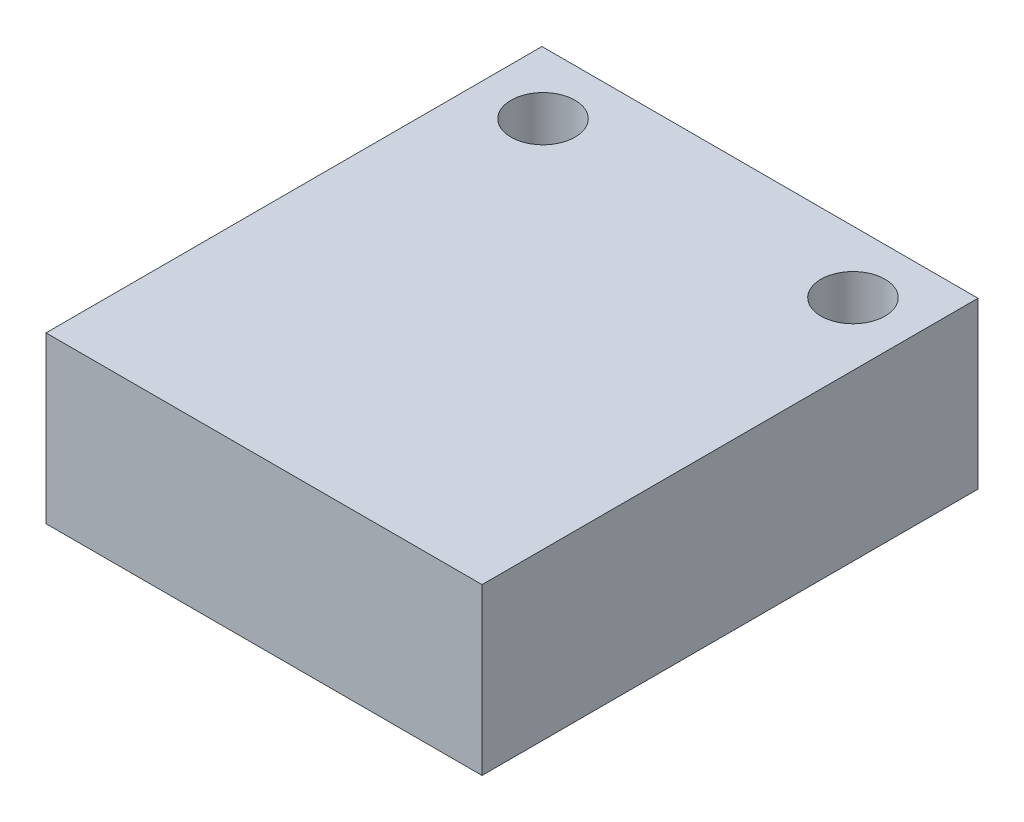
ISO-10303-21;
HEADER;
FILE_DESCRIPTION(('STEP AP214'),'2;1');
FILE_NAME('part.step','',(''),(''),'','','');
FILE_SCHEMA(('AUTOMOTIVE_DESIGN { 1 0 10303 214 1 1 1 1 }'));
ENDSEC;
DATA;
#1=APPLICATION_CONTEXT('core data for automotive mechanical design processes');
#2=APPLICATION_PROTOCOL_DEFINITION('international standard','automotive_design',2000,#1);
#3=PRODUCT_CONTEXT('',#1,'mechanical');
#4=PRODUCT('Part','Part','',(#3));
#5=PRODUCT_RELATED_PRODUCT_CATEGORY('part','',(#4));
#6=PRODUCT_DEFINITION_FORMATION('','',#4);
#7=PRODUCT_DEFINITION_CONTEXT('part definition',#1,'design');
#8=PRODUCT_DEFINITION('design','',#6,#7);
#9=PRODUCT_DEFINITION_SHAPE('','',#8);
#10=(LENGTH_UNIT() NAMED_UNIT(*) SI_UNIT(.MILLI.,.METRE.));
#11=(NAMED_UNIT(*) PLANE_ANGLE_UNIT() SI_UNIT($,.RADIAN.));
#12=(NAMED_UNIT(*) SI_UNIT($,.STERADIAN.) SOLID_ANGLE_UNIT());
#13=UNCERTAINTY_MEASURE_WITH_UNIT(LENGTH_MEASURE(1.E-05),#10,'distance_accuracy_value','');
#14=(GEOMETRIC_REPRESENTATION_CONTEXT(3) GLOBAL_UNCERTAINTY_ASSIGNED_CONTEXT((#13)) GLOBAL_UNIT_ASSIGNED_CONTEXT((#10,
#11,#12)) REPRESENTATION_CONTEXT('',''));
#15=CARTESIAN_POINT('',(0.,0.,0.));
#16=DIRECTION('',(0.,0.,1.));
#17=DIRECTION('',(1.,0.,0.));
#18=AXIS2_PLACEMENT_3D('',#15,#16,#17);
#19=CARTESIAN_POINT('',(10.55,8.,-12.));
#20=DIRECTION('',(-1.,0.,0.));
#21=DIRECTION('',(0.,0.,1.));
#22=AXIS2_PLACEMENT_3D('',#19,#20,#21);
#23=PLANE('',#22);
#24=DIRECTION('',(0.,0.,-1.));
#25=VECTOR('',#24,1.);
#26=CARTESIAN_POINT('',(10.55,0.,-12.));
#27=LINE('',#26,#25);
#28=CARTESIAN_POINT('',(10.55,0.,12.));
#29=VERTEX_POINT('',#28);
#30=CARTESIAN_POINT('',(10.55,0.,-12.));
#31=VERTEX_POINT('',#30);
#32=EDGE_CURVE('E96',#29,#31,#27,.T.);
#33=ORIENTED_EDGE('',*,*,#32,.T.);
#34=DIRECTION('',(0.,-1.,0.));
#35=VECTOR('',#34,1.);
#36=CARTESIAN_POINT('',(10.55,8.,-12.));
#37=LINE('',#36,#35);
#38=CARTESIAN_POINT('',(10.55,8.,-12.));
#39=VERTEX_POINT('',#38);
#40=EDGE_CURVE('E11',#39,#31,#37,.T.);
#41=ORIENTED_EDGE('',*,*,#40,.F.);
#42=DIRECTION('',(0.,0.,-1.));
#43=VECTOR('',#42,1.);
#44=CARTESIAN_POINT('',(10.55,8.,-12.));
#45=LINE('',#44,#43);
#46=CARTESIAN_POINT('',(10.55,8.,12.));
#47=VERTEX_POINT('',#46);
#48=EDGE_CURVE('E84',#47,#39,#45,.T.);
#49=ORIENTED_EDGE('',*,*,#48,.F.);
#50=DIRECTION('',(0.,-1.,0.));
#51=VECTOR('',#50,1.);
#52=CARTESIAN_POINT('',(10.55,8.,12.));
#53=LINE('',#52,#51);
#54=EDGE_CURVE('E92',#47,#29,#53,.T.);
#55=ORIENTED_EDGE('',*,*,#54,.T.);
#56=EDGE_LOOP('',(#33,#41,#49,#55));
#57=FACE_BOUND('',#56,.T.);
#58=ADVANCED_FACE('F33',(#57),#23,.F.);
#59=CARTESIAN_POINT('',(-10.55,8.,-12.));
#60=DIRECTION('',(0.,0.,1.));
#61=DIRECTION('',(1.,0.,0.));
#62=AXIS2_PLACEMENT_3D('',#59,#60,#61);
#63=PLANE('',#62);
#64=DIRECTION('',(-1.,0.,0.));
#65=VECTOR('',#64,1.);
#66=CARTESIAN_POINT('',(-10.55,0.,-12.));
#67=LINE('',#66,#65);
#68=CARTESIAN_POINT('',(-10.55,0.,-12.));
#69=VERTEX_POINT('',#68);
#70=EDGE_CURVE('E88',#31,#69,#67,.T.);
#71=ORIENTED_EDGE('',*,*,#70,.T.);
#72=DIRECTION('',(0.,-1.,0.));
#73=VECTOR('',#72,1.);
#74=CARTESIAN_POINT('',(-10.55,8.,-12.));
#75=LINE('',#74,#73);
#76=CARTESIAN_POINT('',(-10.55,8.,-12.));
#77=VERTEX_POINT('',#76);
#78=EDGE_CURVE('E41',#77,#69,#75,.T.);
#79=ORIENTED_EDGE('',*,*,#78,.F.);
#80=DIRECTION('',(-1.,0.,0.));
#81=VECTOR('',#80,1.);
#82=CARTESIAN_POINT('',(-10.55,8.,-12.));
#83=LINE('',#82,#81);
#84=EDGE_CURVE('E79',#39,#77,#83,.T.);
#85=ORIENTED_EDGE('',*,*,#84,.F.);
#86=ORIENTED_EDGE('',*,*,#40,.T.);
#87=EDGE_LOOP('',(#71,#79,#85,#86));
#88=FACE_BOUND('',#87,.T.);
#89=ADVANCED_FACE('F87',(#88),#63,.F.);
#90=CARTESIAN_POINT('',(-10.55,8.,-12.));
#91=DIRECTION('',(1.,0.,0.));
#92=DIRECTION('',(0.,0.,-1.));
#93=AXIS2_PLACEMENT_3D('',#90,#91,#92);
#94=PLANE('',#93);
#95=DIRECTION('',(0.,0.,1.));
#96=VECTOR('',#95,1.);
#97=CARTESIAN_POINT('',(-10.55,0.,-12.));
#98=LINE('',#97,#96);
#99=CARTESIAN_POINT('',(-10.55,0.,12.));
#100=VERTEX_POINT('',#99);
#101=EDGE_CURVE('E66',#69,#100,#98,.T.);
#102=ORIENTED_EDGE('',*,*,#101,.T.);
#103=DIRECTION('',(0.,-1.,0.));
#104=VECTOR('',#103,1.);
#105=CARTESIAN_POINT('',(-10.55,8.,12.));
#106=LINE('',#105,#104);
#107=CARTESIAN_POINT('',(-10.55,8.,12.));
#108=VERTEX_POINT('',#107);
#109=EDGE_CURVE('E89',#108,#100,#106,.T.);
#110=ORIENTED_EDGE('',*,*,#109,.F.);
#111=DIRECTION('',(0.,0.,1.));
#112=VECTOR('',#111,1.);
#113=CARTESIAN_POINT('',(-10.55,8.,-12.));
#114=LINE('',#113,#112);
#115=EDGE_CURVE('E82',#77,#108,#114,.T.);
#116=ORIENTED_EDGE('',*,*,#115,.F.);
#117=ORIENTED_EDGE('',*,*,#78,.T.);
#118=EDGE_LOOP('',(#102,#110,#116,#117));
#119=FACE_BOUND('',#118,.T.);
#120=ADVANCED_FACE('F90',(#119),#94,.F.);
#121=CARTESIAN_POINT('',(-10.55,8.,12.));
#122=DIRECTION('',(0.,0.,-1.));
#123=DIRECTION('',(-1.,0.,0.));
#124=AXIS2_PLACEMENT_3D('',#121,#122,#123);
#125=PLANE('',#124);
#126=DIRECTION('',(1.,0.,0.));
#127=VECTOR('',#126,1.);
#128=CARTESIAN_POINT('',(-10.55,0.,12.));
#129=LINE('',#128,#127);
#130=EDGE_CURVE('E72',#100,#29,#129,.T.);
#131=ORIENTED_EDGE('',*,*,#130,.T.);
#132=ORIENTED_EDGE('',*,*,#54,.F.);
#133=DIRECTION('',(1.,0.,0.));
#134=VECTOR('',#133,1.);
#135=CARTESIAN_POINT('',(-10.55,8.,12.));
#136=LINE('',#135,#134);
#137=EDGE_CURVE('E49',#108,#47,#136,.T.);
#138=ORIENTED_EDGE('',*,*,#137,.F.);
#139=ORIENTED_EDGE('',*,*,#109,.T.);
#140=EDGE_LOOP('',(#131,#132,#138,#139));
#141=FACE_BOUND('',#140,.T.);
#142=ADVANCED_FACE('F104',(#141),#125,.F.);
#143=CARTESIAN_POINT('',(0.,8.,0.));
#144=DIRECTION('',(0.,1.,0.));
#145=DIRECTION('',(0.,0.,1.));
#146=AXIS2_PLACEMENT_3D('',#143,#144,#145);
#147=PLANE('',#146);
#148=CARTESIAN_POINT('',(-7.5,8.,-9.));
#149=DIRECTION('',(0.,1.,0.));
#150=DIRECTION('',(0.,0.,1.));
#151=AXIS2_PLACEMENT_3D('',#148,#149,#150);
#152=CIRCLE('',#151,1.55);
#153=CARTESIAN_POINT('',(-7.5,8.,-7.45));
#154=VERTEX_POINT('',#153);
#155=EDGE_CURVE('E116',#154,#154,#152,.T.);
#156=ORIENTED_EDGE('',*,*,#155,.F.);
#157=EDGE_LOOP('',(#156));
#158=FACE_BOUND('',#157,.T.);
#159=CARTESIAN_POINT('',(7.5,8.,-9.));
#160=DIRECTION('',(0.,1.,0.));
#161=DIRECTION('',(0.,0.,-1.));
#162=AXIS2_PLACEMENT_3D('',#159,#160,#161);
#163=CIRCLE('',#162,1.55);
#164=CARTESIAN_POINT('',(7.5,8.,-10.55));
#165=VERTEX_POINT('',#164);
#166=EDGE_CURVE('E110',#165,#165,#163,.T.);
#167=ORIENTED_EDGE('',*,*,#166,.F.);
#168=EDGE_LOOP('',(#167));
#169=FACE_BOUND('',#168,.T.);
#170=ORIENTED_EDGE('',*,*,#48,.T.);
#171=ORIENTED_EDGE('',*,*,#84,.T.);
#172=ORIENTED_EDGE('',*,*,#115,.T.);
#173=ORIENTED_EDGE('',*,*,#137,.T.);
#174=EDGE_LOOP('',(#170,#171,#172,#173));
#175=FACE_BOUND('',#174,.T.);
#176=ADVANCED_FACE('F80',(#158,#169,#175),#147,.T.);
#177=CARTESIAN_POINT('',(0.,0.,0.));
#178=DIRECTION('',(0.,1.,0.));
#179=DIRECTION('',(0.,0.,1.));
#180=AXIS2_PLACEMENT_3D('',#177,#178,#179);
#181=PLANE('',#180);
#182=CARTESIAN_POINT('',(-7.5,0.,-9.));
#183=DIRECTION('',(0.,1.,0.));
#184=DIRECTION('',(0.,0.,1.));
#185=AXIS2_PLACEMENT_3D('',#182,#183,#184);
#186=CIRCLE('',#185,1.55);
#187=CARTESIAN_POINT('',(-7.5,0.,-7.45));
#188=VERTEX_POINT('',#187);
#189=EDGE_CURVE('E99',#188,#188,#186,.T.);
#190=ORIENTED_EDGE('',*,*,#189,.T.);
#191=EDGE_LOOP('',(#190));
#192=FACE_BOUND('',#191,.T.);
#193=CARTESIAN_POINT('',(7.5,0.,-9.));
#194=DIRECTION('',(0.,1.,0.));
#195=DIRECTION('',(0.,0.,-1.));
#196=AXIS2_PLACEMENT_3D('',#193,#194,#195);
#197=CIRCLE('',#196,1.55);
#198=CARTESIAN_POINT('',(7.5,0.,-10.55));
#199=VERTEX_POINT('',#198);
#200=EDGE_CURVE('E113',#199,#199,#197,.T.);
#201=ORIENTED_EDGE('',*,*,#200,.T.);
#202=EDGE_LOOP('',(#201));
#203=FACE_BOUND('',#202,.T.);
#204=ORIENTED_EDGE('',*,*,#32,.F.);
#205=ORIENTED_EDGE('',*,*,#130,.F.);
#206=ORIENTED_EDGE('',*,*,#101,.F.);
#207=ORIENTED_EDGE('',*,*,#70,.F.);
#208=EDGE_LOOP('',(#204,#205,#206,#207));
#209=FACE_BOUND('',#208,.T.);
#210=ADVANCED_FACE('F107',(#192,#203,#209),#181,.F.);
#211=CARTESIAN_POINT('',(7.5,0.,-9.));
#212=DIRECTION('',(0.,1.,0.));
#213=DIRECTION('',(0.,0.,1.));
#214=AXIS2_PLACEMENT_3D('',#211,#212,#213);
#215=CYLINDRICAL_SURFACE('',#214,1.55);
#216=ORIENTED_EDGE('',*,*,#200,.F.);
#217=EDGE_LOOP('',(#216));
#218=FACE_BOUND('',#217,.T.);
#219=ORIENTED_EDGE('',*,*,#166,.T.);
#220=EDGE_LOOP('',(#219));
#221=FACE_BOUND('',#220,.T.);
#222=ADVANCED_FACE('F127',(#218,#221),#215,.F.);
#223=CARTESIAN_POINT('',(-7.5,0.,-9.));
#224=DIRECTION('',(0.,1.,0.));
#225=DIRECTION('',(0.,0.,1.));
#226=AXIS2_PLACEMENT_3D('',#223,#224,#225);
#227=CYLINDRICAL_SURFACE('',#226,1.55);
#228=ORIENTED_EDGE('',*,*,#189,.F.);
#229=EDGE_LOOP('',(#228));
#230=FACE_BOUND('',#229,.T.);
#231=ORIENTED_EDGE('',*,*,#155,.T.);
#232=EDGE_LOOP('',(#231));
#233=FACE_BOUND('',#232,.T.);
#234=ADVANCED_FACE('F124',(#230,#233),#227,.F.);
#235=CLOSED_SHELL('',(#58,#89,#120,#142,#176,#210,#222,#234));
#236=MANIFOLD_SOLID_BREP('B2',#235);
#237=ADVANCED_BREP_SHAPE_REPRESENTATION('',(#18,#236),#14);
#238=SHAPE_DEFINITION_REPRESENTATION(#9,#237);
ENDSEC;
END-ISO-10303-21;
